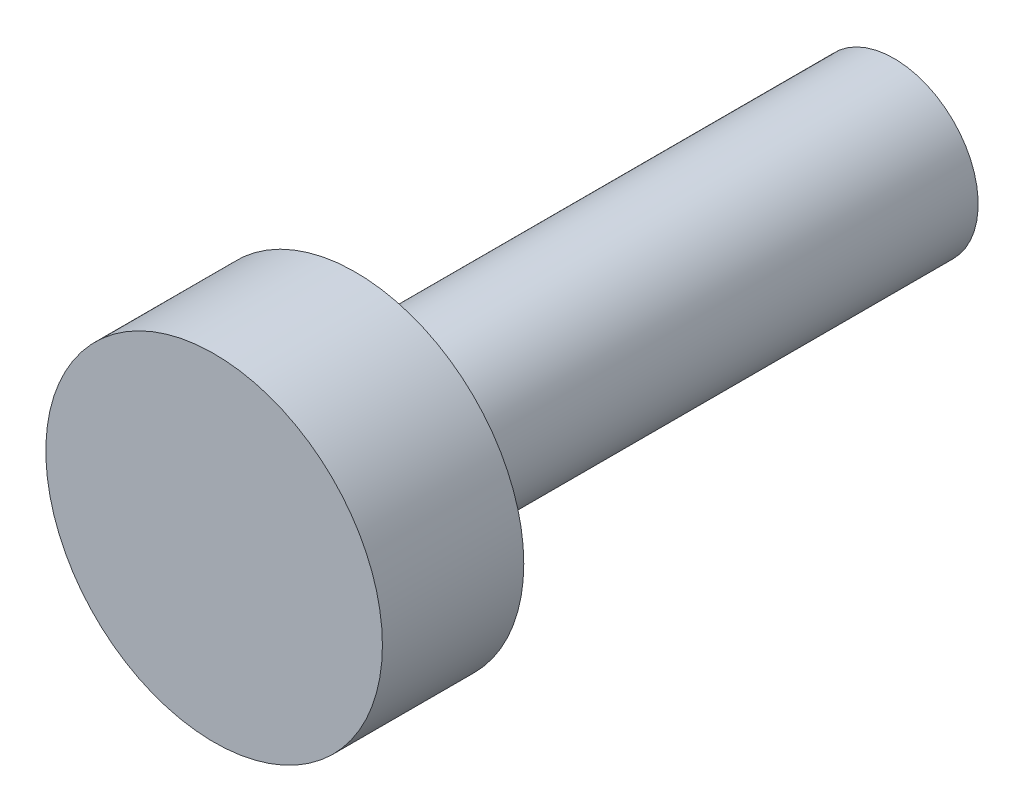
ISO-10303-21;
HEADER;
FILE_DESCRIPTION(('STEP AP214'),'2;1');
FILE_NAME('part.step','',(''),(''),'','','');
FILE_SCHEMA(('AUTOMOTIVE_DESIGN { 1 0 10303 214 1 1 1 1 }'));
ENDSEC;
DATA;
#1=APPLICATION_CONTEXT('core data for automotive mechanical design processes');
#2=APPLICATION_PROTOCOL_DEFINITION('international standard','automotive_design',2000,#1);
#3=PRODUCT_CONTEXT('',#1,'mechanical');
#4=PRODUCT('Part','Part','',(#3));
#5=PRODUCT_RELATED_PRODUCT_CATEGORY('part','',(#4));
#6=PRODUCT_DEFINITION_FORMATION('','',#4);
#7=PRODUCT_DEFINITION_CONTEXT('part definition',#1,'design');
#8=PRODUCT_DEFINITION('design','',#6,#7);
#9=PRODUCT_DEFINITION_SHAPE('','',#8);
#10=(LENGTH_UNIT() NAMED_UNIT(*) SI_UNIT(.MILLI.,.METRE.));
#11=(NAMED_UNIT(*) PLANE_ANGLE_UNIT() SI_UNIT($,.RADIAN.));
#12=(NAMED_UNIT(*) SI_UNIT($,.STERADIAN.) SOLID_ANGLE_UNIT());
#13=UNCERTAINTY_MEASURE_WITH_UNIT(LENGTH_MEASURE(1.E-05),#10,'distance_accuracy_value','');
#14=(GEOMETRIC_REPRESENTATION_CONTEXT(3) GLOBAL_UNCERTAINTY_ASSIGNED_CONTEXT((#13)) GLOBAL_UNIT_ASSIGNED_CONTEXT((#10,
#11,#12)) REPRESENTATION_CONTEXT('',''));
#15=CARTESIAN_POINT('',(0.,0.,0.));
#16=DIRECTION('',(0.,0.,1.));
#17=DIRECTION('',(1.,0.,0.));
#18=AXIS2_PLACEMENT_3D('',#15,#16,#17);
#19=CARTESIAN_POINT('',(0.,0.,2.1));
#20=DIRECTION('',(0.,0.,-1.));
#21=DIRECTION('',(-1.,0.,0.));
#22=AXIS2_PLACEMENT_3D('',#19,#20,#21);
#23=CYLINDRICAL_SURFACE('',#22,2.5);
#24=CARTESIAN_POINT('',(0.,0.,2.1));
#25=DIRECTION('',(0.,0.,1.));
#26=DIRECTION('',(1.,0.,0.));
#27=AXIS2_PLACEMENT_3D('',#24,#25,#26);
#28=CIRCLE('',#27,2.5);
#29=CARTESIAN_POINT('',(2.5,0.,2.1));
#30=VERTEX_POINT('',#29);
#31=EDGE_CURVE('E38',#30,#30,#28,.T.);
#32=ORIENTED_EDGE('',*,*,#31,.F.);
#33=EDGE_LOOP('',(#32));
#34=FACE_BOUND('',#33,.T.);
#35=CARTESIAN_POINT('',(0.,0.,0.));
#36=DIRECTION('',(0.,0.,1.));
#37=DIRECTION('',(1.,0.,0.));
#38=AXIS2_PLACEMENT_3D('',#35,#36,#37);
#39=CIRCLE('',#38,2.5);
#40=CARTESIAN_POINT('',(2.5,0.,0.));
#41=VERTEX_POINT('',#40);
#42=EDGE_CURVE('E34',#41,#41,#39,.T.);
#43=ORIENTED_EDGE('',*,*,#42,.T.);
#44=EDGE_LOOP('',(#43));
#45=FACE_BOUND('',#44,.T.);
#46=ADVANCED_FACE('F31',(#34,#45),#23,.T.);
#47=CARTESIAN_POINT('',(0.,0.,2.1));
#48=DIRECTION('',(0.,0.,1.));
#49=DIRECTION('',(1.,0.,0.));
#50=AXIS2_PLACEMENT_3D('',#47,#48,#49);
#51=PLANE('',#50);
#52=ORIENTED_EDGE('',*,*,#31,.T.);
#53=EDGE_LOOP('',(#52));
#54=FACE_BOUND('',#53,.T.);
#55=ADVANCED_FACE('F55',(#54),#51,.T.);
#56=CARTESIAN_POINT('',(0.,0.,0.));
#57=DIRECTION('',(0.,0.,1.));
#58=DIRECTION('',(1.,0.,0.));
#59=AXIS2_PLACEMENT_3D('',#56,#57,#58);
#60=PLANE('',#59);
#61=CARTESIAN_POINT('',(0.,0.,0.));
#62=DIRECTION('',(0.,0.,-1.));
#63=DIRECTION('',(-1.,0.,0.));
#64=AXIS2_PLACEMENT_3D('',#61,#62,#63);
#65=CIRCLE('',#64,1.25);
#66=CARTESIAN_POINT('',(-1.25,0.,0.));
#67=VERTEX_POINT('',#66);
#68=EDGE_CURVE('E10',#67,#67,#65,.T.);
#69=ORIENTED_EDGE('',*,*,#68,.F.);
#70=EDGE_LOOP('',(#69));
#71=FACE_BOUND('',#70,.T.);
#72=ORIENTED_EDGE('',*,*,#42,.F.);
#73=EDGE_LOOP('',(#72));
#74=FACE_BOUND('',#73,.T.);
#75=ADVANCED_FACE('F52',(#71,#74),#60,.F.);
#76=CARTESIAN_POINT('',(0.,0.,-8.));
#77=DIRECTION('',(0.,0.,1.));
#78=DIRECTION('',(1.,0.,0.));
#79=AXIS2_PLACEMENT_3D('',#76,#77,#78);
#80=CYLINDRICAL_SURFACE('',#79,1.25);
#81=CARTESIAN_POINT('',(0.,0.,-8.));
#82=DIRECTION('',(0.,0.,-1.));
#83=DIRECTION('',(-1.,0.,0.));
#84=AXIS2_PLACEMENT_3D('',#81,#82,#83);
#85=CIRCLE('',#84,1.25);
#86=CARTESIAN_POINT('',(-1.25,0.,-8.));
#87=VERTEX_POINT('',#86);
#88=EDGE_CURVE('E44',#87,#87,#85,.T.);
#89=ORIENTED_EDGE('',*,*,#88,.F.);
#90=EDGE_LOOP('',(#89));
#91=FACE_BOUND('',#90,.T.);
#92=ORIENTED_EDGE('',*,*,#68,.T.);
#93=EDGE_LOOP('',(#92));
#94=FACE_BOUND('',#93,.T.);
#95=ADVANCED_FACE('F54',(#91,#94),#80,.T.);
#96=CARTESIAN_POINT('',(0.,0.,-8.));
#97=DIRECTION('',(0.,0.,-1.));
#98=DIRECTION('',(-1.,0.,0.));
#99=AXIS2_PLACEMENT_3D('',#96,#97,#98);
#100=PLANE('',#99);
#101=ORIENTED_EDGE('',*,*,#88,.T.);
#102=EDGE_LOOP('',(#101));
#103=FACE_BOUND('',#102,.T.);
#104=ADVANCED_FACE('F61',(#103),#100,.T.);
#105=CLOSED_SHELL('',(#46,#55,#75,#95,#104));
#106=MANIFOLD_SOLID_BREP('B2',#105);
#107=ADVANCED_BREP_SHAPE_REPRESENTATION('',(#18,#106),#14);
#108=SHAPE_DEFINITION_REPRESENTATION(#9,#107);
ENDSEC;
END-ISO-10303-21;
